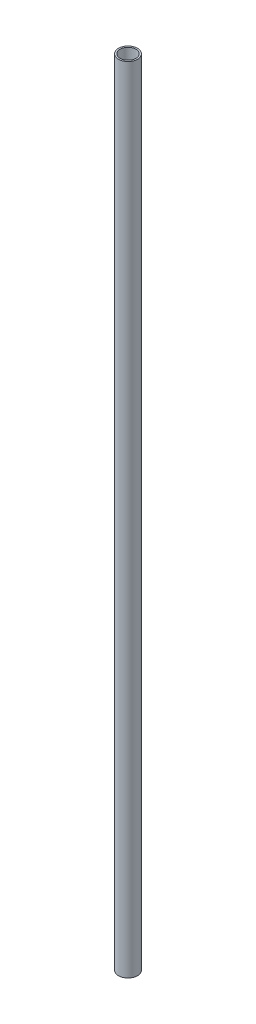
ISO-10303-21;
HEADER;
FILE_DESCRIPTION(('STEP AP214'),'2;1');
FILE_NAME('part.step','',(''),(''),'','','');
FILE_SCHEMA(('AUTOMOTIVE_DESIGN { 1 0 10303 214 1 1 1 1 }'));
ENDSEC;
DATA;
#1=APPLICATION_CONTEXT('core data for automotive mechanical design processes');
#2=APPLICATION_PROTOCOL_DEFINITION('international standard','automotive_design',2000,#1);
#3=PRODUCT_CONTEXT('',#1,'mechanical');
#4=PRODUCT('Part','Part','',(#3));
#5=PRODUCT_RELATED_PRODUCT_CATEGORY('part','',(#4));
#6=PRODUCT_DEFINITION_FORMATION('','',#4);
#7=PRODUCT_DEFINITION_CONTEXT('part definition',#1,'design');
#8=PRODUCT_DEFINITION('design','',#6,#7);
#9=PRODUCT_DEFINITION_SHAPE('','',#8);
#10=(LENGTH_UNIT() NAMED_UNIT(*) SI_UNIT(.MILLI.,.METRE.));
#11=(NAMED_UNIT(*) PLANE_ANGLE_UNIT() SI_UNIT($,.RADIAN.));
#12=(NAMED_UNIT(*) SI_UNIT($,.STERADIAN.) SOLID_ANGLE_UNIT());
#13=UNCERTAINTY_MEASURE_WITH_UNIT(LENGTH_MEASURE(1.E-05),#10,'distance_accuracy_value','');
#14=(GEOMETRIC_REPRESENTATION_CONTEXT(3) GLOBAL_UNCERTAINTY_ASSIGNED_CONTEXT((#13)) GLOBAL_UNIT_ASSIGNED_CONTEXT((#10,
#11,#12)) REPRESENTATION_CONTEXT('',''));
#15=CARTESIAN_POINT('',(0.,0.,0.));
#16=DIRECTION('',(0.,0.,1.));
#17=DIRECTION('',(1.,0.,0.));
#18=AXIS2_PLACEMENT_3D('',#15,#16,#17);
#19=CARTESIAN_POINT('',(0.,-250.,0.));
#20=DIRECTION('',(0.,1.,0.));
#21=DIRECTION('',(0.,0.,1.));
#22=AXIS2_PLACEMENT_3D('',#19,#20,#21);
#23=CYLINDRICAL_SURFACE('',#22,6.);
#24=CARTESIAN_POINT('',(0.,-250.,0.));
#25=DIRECTION('',(0.,1.,0.));
#26=DIRECTION('',(0.,0.,1.));
#27=AXIS2_PLACEMENT_3D('',#24,#25,#26);
#28=CIRCLE('',#27,6.);
#29=CARTESIAN_POINT('',(0.,-250.,6.));
#30=VERTEX_POINT('',#29);
#31=EDGE_CURVE('E10',#30,#30,#28,.T.);
#32=ORIENTED_EDGE('',*,*,#31,.T.);
#33=EDGE_LOOP('',(#32));
#34=FACE_BOUND('',#33,.T.);
#35=CARTESIAN_POINT('',(0.,250.,0.));
#36=DIRECTION('',(0.,1.,0.));
#37=DIRECTION('',(0.,0.,1.));
#38=AXIS2_PLACEMENT_3D('',#35,#36,#37);
#39=CIRCLE('',#38,6.);
#40=CARTESIAN_POINT('',(0.,250.,6.));
#41=VERTEX_POINT('',#40);
#42=EDGE_CURVE('E40',#41,#41,#39,.T.);
#43=ORIENTED_EDGE('',*,*,#42,.F.);
#44=EDGE_LOOP('',(#43));
#45=FACE_BOUND('',#44,.T.);
#46=ADVANCED_FACE('F30',(#34,#45),#23,.T.);
#47=CARTESIAN_POINT('',(0.,-250.,0.));
#48=DIRECTION('',(0.,1.,0.));
#49=DIRECTION('',(0.,0.,1.));
#50=AXIS2_PLACEMENT_3D('',#47,#48,#49);
#51=PLANE('',#50);
#52=CARTESIAN_POINT('',(0.,-250.,0.));
#53=DIRECTION('',(0.,1.,0.));
#54=DIRECTION('',(0.,0.,1.));
#55=AXIS2_PLACEMENT_3D('',#52,#53,#54);
#56=CIRCLE('',#55,5.);
#57=CARTESIAN_POINT('',(0.,-250.,5.));
#58=VERTEX_POINT('',#57);
#59=EDGE_CURVE('E36',#58,#58,#56,.T.);
#60=ORIENTED_EDGE('',*,*,#59,.T.);
#61=EDGE_LOOP('',(#60));
#62=FACE_BOUND('',#61,.T.);
#63=ORIENTED_EDGE('',*,*,#31,.F.);
#64=EDGE_LOOP('',(#63));
#65=FACE_BOUND('',#64,.T.);
#66=ADVANCED_FACE('F59',(#62,#65),#51,.F.);
#67=CARTESIAN_POINT('',(0.,-250.,0.));
#68=DIRECTION('',(0.,1.,0.));
#69=DIRECTION('',(0.,0.,1.));
#70=AXIS2_PLACEMENT_3D('',#67,#68,#69);
#71=CYLINDRICAL_SURFACE('',#70,5.);
#72=ORIENTED_EDGE('',*,*,#59,.F.);
#73=EDGE_LOOP('',(#72));
#74=FACE_BOUND('',#73,.T.);
#75=CARTESIAN_POINT('',(0.,250.,0.));
#76=DIRECTION('',(0.,1.,0.));
#77=DIRECTION('',(0.,0.,1.));
#78=AXIS2_PLACEMENT_3D('',#75,#76,#77);
#79=CIRCLE('',#78,5.);
#80=CARTESIAN_POINT('',(0.,250.,5.));
#81=VERTEX_POINT('',#80);
#82=EDGE_CURVE('E44',#81,#81,#79,.T.);
#83=ORIENTED_EDGE('',*,*,#82,.T.);
#84=EDGE_LOOP('',(#83));
#85=FACE_BOUND('',#84,.T.);
#86=ADVANCED_FACE('F50',(#74,#85),#71,.F.);
#87=CARTESIAN_POINT('',(0.,250.,0.));
#88=DIRECTION('',(0.,1.,0.));
#89=DIRECTION('',(0.,0.,1.));
#90=AXIS2_PLACEMENT_3D('',#87,#88,#89);
#91=PLANE('',#90);
#92=ORIENTED_EDGE('',*,*,#42,.T.);
#93=EDGE_LOOP('',(#92));
#94=FACE_BOUND('',#93,.T.);
#95=ORIENTED_EDGE('',*,*,#82,.F.);
#96=EDGE_LOOP('',(#95));
#97=FACE_BOUND('',#96,.T.);
#98=ADVANCED_FACE('F52',(#94,#97),#91,.T.);
#99=CLOSED_SHELL('',(#46,#66,#86,#98));
#100=MANIFOLD_SOLID_BREP('B2',#99);
#101=ADVANCED_BREP_SHAPE_REPRESENTATION('',(#18,#100),#14);
#102=SHAPE_DEFINITION_REPRESENTATION(#9,#101);
ENDSEC;
END-ISO-10303-21;
